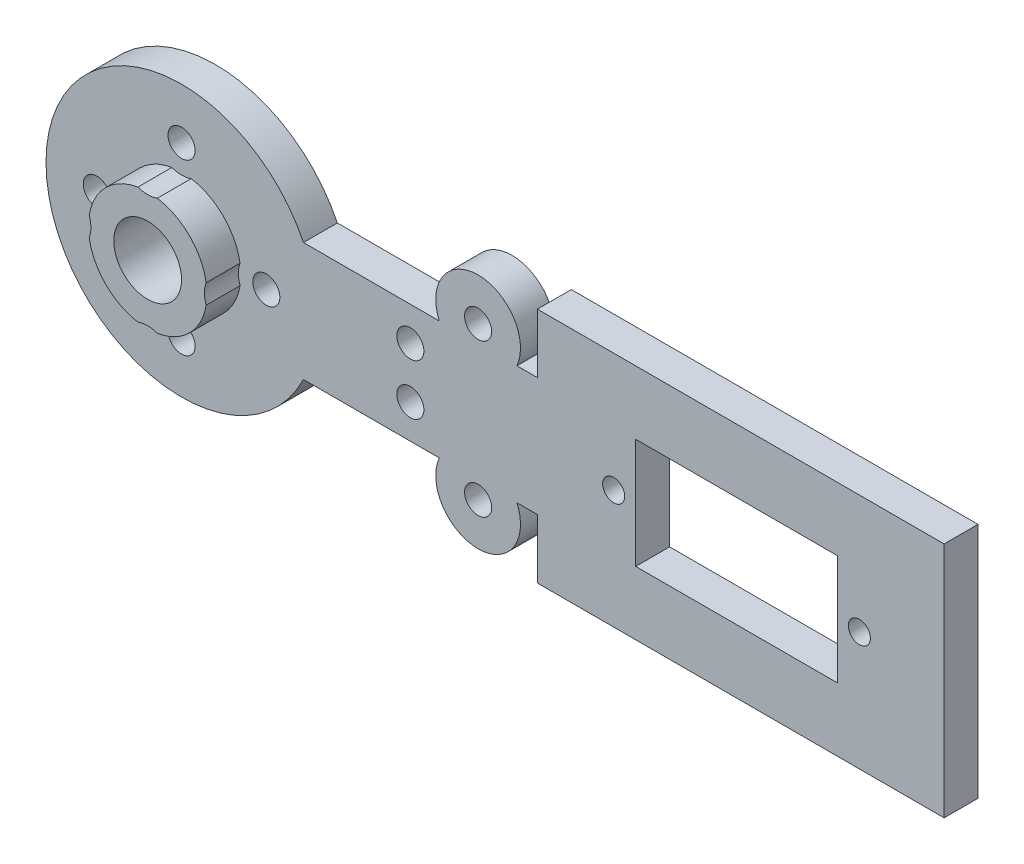
ISO-10303-21;
HEADER;
FILE_DESCRIPTION(('STEP AP214'),'2;1');
FILE_NAME('part.step','',(''),(''),'','','');
FILE_SCHEMA(('AUTOMOTIVE_DESIGN { 1 0 10303 214 1 1 1 1 }'));
ENDSEC;
DATA;
#1=APPLICATION_CONTEXT('core data for automotive mechanical design processes');
#2=APPLICATION_PROTOCOL_DEFINITION('international standard','automotive_design',2000,#1);
#3=PRODUCT_CONTEXT('',#1,'mechanical');
#4=PRODUCT('Part','Part','',(#3));
#5=PRODUCT_RELATED_PRODUCT_CATEGORY('part','',(#4));
#6=PRODUCT_DEFINITION_FORMATION('','',#4);
#7=PRODUCT_DEFINITION_CONTEXT('part definition',#1,'design');
#8=PRODUCT_DEFINITION('design','',#6,#7);
#9=PRODUCT_DEFINITION_SHAPE('','',#8);
#10=(LENGTH_UNIT() NAMED_UNIT(*) SI_UNIT(.MILLI.,.METRE.));
#11=(NAMED_UNIT(*) PLANE_ANGLE_UNIT() SI_UNIT($,.RADIAN.));
#12=(NAMED_UNIT(*) SI_UNIT($,.STERADIAN.) SOLID_ANGLE_UNIT());
#13=UNCERTAINTY_MEASURE_WITH_UNIT(LENGTH_MEASURE(1.E-05),#10,'distance_accuracy_value','');
#14=(GEOMETRIC_REPRESENTATION_CONTEXT(3) GLOBAL_UNCERTAINTY_ASSIGNED_CONTEXT((#13)) GLOBAL_UNIT_ASSIGNED_CONTEXT((#10,
#11,#12)) REPRESENTATION_CONTEXT('',''));
#15=CARTESIAN_POINT('',(0.,0.,0.));
#16=DIRECTION('',(0.,0.,1.));
#17=DIRECTION('',(1.,0.,0.));
#18=AXIS2_PLACEMENT_3D('',#15,#16,#17);
#19=CARTESIAN_POINT('',(0.,0.,8.));
#20=DIRECTION('',(0.,0.,1.));
#21=DIRECTION('',(1.,0.,0.));
#22=AXIS2_PLACEMENT_3D('',#19,#20,#21);
#23=PLANE('',#22);
#24=CARTESIAN_POINT('',(0.,0.,8.));
#25=DIRECTION('',(0.,0.,1.));
#26=DIRECTION('',(1.,0.,0.));
#27=AXIS2_PLACEMENT_3D('',#24,#25,#26);
#28=CIRCLE('',#27,4.);
#29=CARTESIAN_POINT('',(4.,0.,8.));
#30=VERTEX_POINT('',#29);
#31=EDGE_CURVE('E437',#30,#30,#28,.T.);
#32=ORIENTED_EDGE('',*,*,#31,.F.);
#33=EDGE_LOOP('',(#32));
#34=FACE_BOUND('',#33,.T.);
#35=CARTESIAN_POINT('',(10.,0.,8.));
#36=DIRECTION('',(0.,0.,1.));
#37=DIRECTION('',(1.,0.,0.));
#38=AXIS2_PLACEMENT_3D('',#35,#36,#37);
#39=CIRCLE('',#38,3.3);
#40=CARTESIAN_POINT('',(6.9055,1.14632881408433,8.));
#41=VERTEX_POINT('',#40);
#42=CARTESIAN_POINT('',(6.9055,-1.14632881408433,8.));
#43=VERTEX_POINT('',#42);
#44=EDGE_CURVE('E426',#41,#43,#39,.T.);
#45=ORIENTED_EDGE('',*,*,#44,.F.);
#46=CARTESIAN_POINT('',(0.,0.,8.));
#47=DIRECTION('',(0.,0.,1.));
#48=DIRECTION('',(1.,0.,0.));
#49=AXIS2_PLACEMENT_3D('',#46,#47,#48);
#50=CIRCLE('',#49,7.);
#51=CARTESIAN_POINT('',(1.14632881408434,6.9055,8.));
#52=VERTEX_POINT('',#51);
#53=EDGE_CURVE('E234',#41,#52,#50,.T.);
#54=ORIENTED_EDGE('',*,*,#53,.T.);
#55=CARTESIAN_POINT('',(0.,10.,8.));
#56=DIRECTION('',(0.,0.,1.));
#57=DIRECTION('',(1.,0.,0.));
#58=AXIS2_PLACEMENT_3D('',#55,#56,#57);
#59=CIRCLE('',#58,3.3);
#60=CARTESIAN_POINT('',(-1.14632881408434,6.9055,8.));
#61=VERTEX_POINT('',#60);
#62=EDGE_CURVE('E225',#61,#52,#59,.T.);
#63=ORIENTED_EDGE('',*,*,#62,.F.);
#64=CARTESIAN_POINT('',(-6.9055,1.14632881408434,8.));
#65=VERTEX_POINT('',#64);
#66=EDGE_CURVE('E442',#61,#65,#50,.T.);
#67=ORIENTED_EDGE('',*,*,#66,.T.);
#68=CARTESIAN_POINT('',(-10.,0.,8.));
#69=DIRECTION('',(0.,0.,1.));
#70=DIRECTION('',(1.,0.,0.));
#71=AXIS2_PLACEMENT_3D('',#68,#69,#70);
#72=CIRCLE('',#71,3.3);
#73=CARTESIAN_POINT('',(-6.9055,-1.14632881408434,8.));
#74=VERTEX_POINT('',#73);
#75=EDGE_CURVE('E454',#74,#65,#72,.T.);
#76=ORIENTED_EDGE('',*,*,#75,.F.);
#77=CARTESIAN_POINT('',(-1.14632881408434,-6.9055,8.));
#78=VERTEX_POINT('',#77);
#79=EDGE_CURVE('E444',#74,#78,#50,.T.);
#80=ORIENTED_EDGE('',*,*,#79,.T.);
#81=CARTESIAN_POINT('',(0.,-10.,8.));
#82=DIRECTION('',(0.,0.,1.));
#83=DIRECTION('',(1.,0.,0.));
#84=AXIS2_PLACEMENT_3D('',#81,#82,#83);
#85=CIRCLE('',#84,3.3);
#86=CARTESIAN_POINT('',(1.14632881408434,-6.9055,8.));
#87=VERTEX_POINT('',#86);
#88=EDGE_CURVE('E203',#87,#78,#85,.T.);
#89=ORIENTED_EDGE('',*,*,#88,.F.);
#90=EDGE_CURVE('E438',#87,#43,#50,.T.);
#91=ORIENTED_EDGE('',*,*,#90,.T.);
#92=EDGE_LOOP('',(#45,#54,#63,#67,#76,#80,#89,#91));
#93=FACE_BOUND('',#92,.T.);
#94=ADVANCED_FACE('F43',(#34,#93),#23,.T.);
#95=CARTESIAN_POINT('',(0.,0.,8.));
#96=DIRECTION('',(0.,0.,-1.));
#97=DIRECTION('',(-1.,0.,0.));
#98=AXIS2_PLACEMENT_3D('',#95,#96,#97);
#99=CYLINDRICAL_SURFACE('',#98,7.);
#100=DIRECTION('',(0.,0.,-1.));
#101=VECTOR('',#100,1.);
#102=CARTESIAN_POINT('',(6.9055,-1.14632881408434,6.));
#103=LINE('',#102,#101);
#104=CARTESIAN_POINT('',(6.9055,-1.14632881408433,4.));
#105=VERTEX_POINT('',#104);
#106=EDGE_CURVE('E11',#43,#105,#103,.T.);
#107=ORIENTED_EDGE('',*,*,#106,.F.);
#108=ORIENTED_EDGE('',*,*,#90,.F.);
#109=DIRECTION('',(0.,0.,-1.));
#110=VECTOR('',#109,1.);
#111=CARTESIAN_POINT('',(1.14632881408434,-6.9055,6.));
#112=LINE('',#111,#110);
#113=CARTESIAN_POINT('',(1.14632881408434,-6.9055,4.));
#114=VERTEX_POINT('',#113);
#115=EDGE_CURVE('E208',#114,#87,#112,.F.);
#116=ORIENTED_EDGE('',*,*,#115,.F.);
#117=CARTESIAN_POINT('',(0.,0.,4.));
#118=DIRECTION('',(0.,0.,1.));
#119=DIRECTION('',(1.,0.,0.));
#120=AXIS2_PLACEMENT_3D('',#117,#118,#119);
#121=CIRCLE('',#120,7.);
#122=EDGE_CURVE('E221',#114,#105,#121,.T.);
#123=ORIENTED_EDGE('',*,*,#122,.T.);
#124=EDGE_LOOP('',(#107,#108,#116,#123));
#125=FACE_BOUND('',#124,.T.);
#126=ADVANCED_FACE('F459',(#125),#99,.T.);
#127=DIRECTION('',(0.,0.,-1.));
#128=VECTOR('',#127,1.);
#129=CARTESIAN_POINT('',(6.9055,1.14632881408434,6.));
#130=LINE('',#129,#128);
#131=CARTESIAN_POINT('',(6.9055,1.14632881408433,4.));
#132=VERTEX_POINT('',#131);
#133=EDGE_CURVE('E51',#132,#41,#130,.F.);
#134=ORIENTED_EDGE('',*,*,#133,.F.);
#135=CARTESIAN_POINT('',(1.14632881408434,6.9055,4.));
#136=VERTEX_POINT('',#135);
#137=EDGE_CURVE('E230',#132,#136,#121,.T.);
#138=ORIENTED_EDGE('',*,*,#137,.T.);
#139=DIRECTION('',(0.,0.,-1.));
#140=VECTOR('',#139,1.);
#141=CARTESIAN_POINT('',(1.14632881408434,6.9055,6.));
#142=LINE('',#141,#140);
#143=EDGE_CURVE('E419',#52,#136,#142,.T.);
#144=ORIENTED_EDGE('',*,*,#143,.F.);
#145=ORIENTED_EDGE('',*,*,#53,.F.);
#146=EDGE_LOOP('',(#134,#138,#144,#145));
#147=FACE_BOUND('',#146,.T.);
#148=ADVANCED_FACE('F445',(#147),#99,.T.);
#149=DIRECTION('',(0.,0.,-1.));
#150=VECTOR('',#149,1.);
#151=CARTESIAN_POINT('',(-6.9055,1.14632881408434,6.));
#152=LINE('',#151,#150);
#153=CARTESIAN_POINT('',(-6.9055,1.14632881408434,4.));
#154=VERTEX_POINT('',#153);
#155=EDGE_CURVE('E421',#65,#154,#152,.T.);
#156=ORIENTED_EDGE('',*,*,#155,.F.);
#157=ORIENTED_EDGE('',*,*,#66,.F.);
#158=DIRECTION('',(0.,0.,-1.));
#159=VECTOR('',#158,1.);
#160=CARTESIAN_POINT('',(-1.14632881408434,6.9055,6.));
#161=LINE('',#160,#159);
#162=CARTESIAN_POINT('',(-1.14632881408434,6.9055,4.));
#163=VERTEX_POINT('',#162);
#164=EDGE_CURVE('E209',#163,#61,#161,.F.);
#165=ORIENTED_EDGE('',*,*,#164,.F.);
#166=EDGE_CURVE('E228',#163,#154,#121,.T.);
#167=ORIENTED_EDGE('',*,*,#166,.T.);
#168=EDGE_LOOP('',(#156,#157,#165,#167));
#169=FACE_BOUND('',#168,.T.);
#170=ADVANCED_FACE('F464',(#169),#99,.T.);
#171=DIRECTION('',(0.,0.,-1.));
#172=VECTOR('',#171,1.);
#173=CARTESIAN_POINT('',(-6.9055,-1.14632881408434,6.));
#174=LINE('',#173,#172);
#175=CARTESIAN_POINT('',(-6.9055,-1.14632881408434,4.));
#176=VERTEX_POINT('',#175);
#177=EDGE_CURVE('E224',#176,#74,#174,.F.);
#178=ORIENTED_EDGE('',*,*,#177,.F.);
#179=CARTESIAN_POINT('',(-1.14632881408434,-6.9055,4.));
#180=VERTEX_POINT('',#179);
#181=EDGE_CURVE('E216',#176,#180,#121,.T.);
#182=ORIENTED_EDGE('',*,*,#181,.T.);
#183=DIRECTION('',(0.,0.,-1.));
#184=VECTOR('',#183,1.);
#185=CARTESIAN_POINT('',(-1.14632881408434,-6.9055,6.));
#186=LINE('',#185,#184);
#187=EDGE_CURVE('E201',#78,#180,#186,.T.);
#188=ORIENTED_EDGE('',*,*,#187,.F.);
#189=ORIENTED_EDGE('',*,*,#79,.F.);
#190=EDGE_LOOP('',(#178,#182,#188,#189));
#191=FACE_BOUND('',#190,.T.);
#192=ADVANCED_FACE('F223',(#191),#99,.T.);
#193=CARTESIAN_POINT('',(0.,7.,4.));
#194=DIRECTION('',(0.,-1.,0.));
#195=DIRECTION('',(0.,0.,-1.));
#196=AXIS2_PLACEMENT_3D('',#193,#194,#195);
#197=PLANE('',#196);
#198=DIRECTION('',(0.,0.,-1.));
#199=VECTOR('',#198,1.);
#200=CARTESIAN_POINT('',(30.4174243050442,7.,4.));
#201=LINE('',#200,#199);
#202=CARTESIAN_POINT('',(30.4174243050442,7.,0.));
#203=VERTEX_POINT('',#202);
#204=CARTESIAN_POINT('',(30.4174243050442,7.,4.));
#205=VERTEX_POINT('',#204);
#206=EDGE_CURVE('E229',#203,#205,#201,.F.);
#207=ORIENTED_EDGE('',*,*,#206,.F.);
#208=DIRECTION('',(-1.,0.,0.));
#209=VECTOR('',#208,1.);
#210=CARTESIAN_POINT('',(0.,7.,0.));
#211=LINE('',#210,#209);
#212=CARTESIAN_POINT('',(14.3874945699382,7.,0.));
#213=VERTEX_POINT('',#212);
#214=EDGE_CURVE('E368',#203,#213,#211,.T.);
#215=ORIENTED_EDGE('',*,*,#214,.T.);
#216=DIRECTION('',(0.,0.,-1.));
#217=VECTOR('',#216,1.);
#218=CARTESIAN_POINT('',(14.3874945699382,7.,4.));
#219=LINE('',#218,#217);
#220=CARTESIAN_POINT('',(14.3874945699382,7.,4.));
#221=VERTEX_POINT('',#220);
#222=EDGE_CURVE('E346',#221,#213,#219,.T.);
#223=ORIENTED_EDGE('',*,*,#222,.F.);
#224=DIRECTION('',(-1.,0.,0.));
#225=VECTOR('',#224,1.);
#226=CARTESIAN_POINT('',(0.,7.,4.));
#227=LINE('',#226,#225);
#228=EDGE_CURVE('E359',#205,#221,#227,.T.);
#229=ORIENTED_EDGE('',*,*,#228,.F.);
#230=EDGE_LOOP('',(#207,#215,#223,#229));
#231=FACE_BOUND('',#230,.T.);
#232=ADVANCED_FACE('F581',(#231),#197,.F.);
#233=DIRECTION('',(0.,0.,-1.));
#234=VECTOR('',#233,1.);
#235=CARTESIAN_POINT('',(39.5825756949558,7.,4.));
#236=LINE('',#235,#234);
#237=CARTESIAN_POINT('',(39.5825756949558,7.,4.));
#238=VERTEX_POINT('',#237);
#239=CARTESIAN_POINT('',(39.5825756949558,7.,0.));
#240=VERTEX_POINT('',#239);
#241=EDGE_CURVE('E408',#238,#240,#236,.T.);
#242=ORIENTED_EDGE('',*,*,#241,.F.);
#243=CARTESIAN_POINT('',(42.,7.,4.));
#244=VERTEX_POINT('',#243);
#245=EDGE_CURVE('E365',#244,#238,#227,.T.);
#246=ORIENTED_EDGE('',*,*,#245,.F.);
#247=DIRECTION('',(0.,0.,1.));
#248=VECTOR('',#247,1.);
#249=CARTESIAN_POINT('',(42.,7.,4.));
#250=LINE('',#249,#248);
#251=CARTESIAN_POINT('',(42.,7.,0.));
#252=VERTEX_POINT('',#251);
#253=EDGE_CURVE('E336',#252,#244,#250,.T.);
#254=ORIENTED_EDGE('',*,*,#253,.F.);
#255=EDGE_CURVE('E367',#252,#240,#211,.T.);
#256=ORIENTED_EDGE('',*,*,#255,.T.);
#257=EDGE_LOOP('',(#242,#246,#254,#256));
#258=FACE_BOUND('',#257,.T.);
#259=ADVANCED_FACE('F582',(#258),#197,.F.);
#260=CARTESIAN_POINT('',(0.,-7.,4.));
#261=DIRECTION('',(0.,1.,0.));
#262=DIRECTION('',(0.,0.,1.));
#263=AXIS2_PLACEMENT_3D('',#260,#261,#262);
#264=PLANE('',#263);
#265=DIRECTION('',(0.,0.,-1.));
#266=VECTOR('',#265,1.);
#267=CARTESIAN_POINT('',(39.5825756949558,-7.,4.));
#268=LINE('',#267,#266);
#269=CARTESIAN_POINT('',(39.5825756949558,-7.,0.));
#270=VERTEX_POINT('',#269);
#271=CARTESIAN_POINT('',(39.5825756949558,-7.,4.));
#272=VERTEX_POINT('',#271);
#273=EDGE_CURVE('E406',#270,#272,#268,.F.);
#274=ORIENTED_EDGE('',*,*,#273,.F.);
#275=DIRECTION('',(1.,0.,0.));
#276=VECTOR('',#275,1.);
#277=CARTESIAN_POINT('',(0.,-7.,0.));
#278=LINE('',#277,#276);
#279=CARTESIAN_POINT('',(42.,-7.,0.));
#280=VERTEX_POINT('',#279);
#281=EDGE_CURVE('E358',#270,#280,#278,.T.);
#282=ORIENTED_EDGE('',*,*,#281,.T.);
#283=DIRECTION('',(0.,0.,-1.));
#284=VECTOR('',#283,1.);
#285=CARTESIAN_POINT('',(42.,-7.,4.));
#286=LINE('',#285,#284);
#287=CARTESIAN_POINT('',(42.,-7.,4.));
#288=VERTEX_POINT('',#287);
#289=EDGE_CURVE('E341',#288,#280,#286,.T.);
#290=ORIENTED_EDGE('',*,*,#289,.F.);
#291=DIRECTION('',(1.,0.,0.));
#292=VECTOR('',#291,1.);
#293=CARTESIAN_POINT('',(0.,-7.,4.));
#294=LINE('',#293,#292);
#295=EDGE_CURVE('E363',#272,#288,#294,.T.);
#296=ORIENTED_EDGE('',*,*,#295,.F.);
#297=EDGE_LOOP('',(#274,#282,#290,#296));
#298=FACE_BOUND('',#297,.T.);
#299=ADVANCED_FACE('F44',(#298),#264,.F.);
#300=DIRECTION('',(0.,0.,-1.));
#301=VECTOR('',#300,1.);
#302=CARTESIAN_POINT('',(30.4174243050442,-7.,4.));
#303=LINE('',#302,#301);
#304=CARTESIAN_POINT('',(30.4174243050442,-7.,4.));
#305=VERTEX_POINT('',#304);
#306=CARTESIAN_POINT('',(30.4174243050442,-7.,0.));
#307=VERTEX_POINT('',#306);
#308=EDGE_CURVE('E385',#305,#307,#303,.T.);
#309=ORIENTED_EDGE('',*,*,#308,.F.);
#310=CARTESIAN_POINT('',(14.3874945699382,-7.,4.));
#311=VERTEX_POINT('',#310);
#312=EDGE_CURVE('E357',#311,#305,#294,.T.);
#313=ORIENTED_EDGE('',*,*,#312,.F.);
#314=DIRECTION('',(0.,0.,-1.));
#315=VECTOR('',#314,1.);
#316=CARTESIAN_POINT('',(14.3874945699382,-7.,4.));
#317=LINE('',#316,#315);
#318=CARTESIAN_POINT('',(14.3874945699382,-7.,0.));
#319=VERTEX_POINT('',#318);
#320=EDGE_CURVE('E352',#319,#311,#317,.F.);
#321=ORIENTED_EDGE('',*,*,#320,.F.);
#322=EDGE_CURVE('E366',#319,#307,#278,.T.);
#323=ORIENTED_EDGE('',*,*,#322,.T.);
#324=EDGE_LOOP('',(#309,#313,#321,#323));
#325=FACE_BOUND('',#324,.T.);
#326=ADVANCED_FACE('F579',(#325),#264,.F.);
#327=CARTESIAN_POINT('',(0.,0.,4.));
#328=DIRECTION('',(0.,0.,-1.));
#329=DIRECTION('',(-1.,0.,0.));
#330=AXIS2_PLACEMENT_3D('',#327,#328,#329);
#331=PLANE('',#330);
#332=ORIENTED_EDGE('',*,*,#137,.F.);
#333=CARTESIAN_POINT('',(10.,0.,4.));
#334=DIRECTION('',(0.,0.,1.));
#335=DIRECTION('',(1.,0.,0.));
#336=AXIS2_PLACEMENT_3D('',#333,#334,#335);
#337=CIRCLE('',#336,3.3);
#338=EDGE_CURVE('E427',#132,#105,#337,.T.);
#339=ORIENTED_EDGE('',*,*,#338,.T.);
#340=ORIENTED_EDGE('',*,*,#122,.F.);
#341=CARTESIAN_POINT('',(0.,-10.,4.));
#342=DIRECTION('',(0.,0.,1.));
#343=DIRECTION('',(1.,0.,0.));
#344=AXIS2_PLACEMENT_3D('',#341,#342,#343);
#345=CIRCLE('',#344,3.3);
#346=EDGE_CURVE('E59',#114,#180,#345,.T.);
#347=ORIENTED_EDGE('',*,*,#346,.T.);
#348=ORIENTED_EDGE('',*,*,#181,.F.);
#349=CARTESIAN_POINT('',(-10.,0.,4.));
#350=DIRECTION('',(0.,0.,1.));
#351=DIRECTION('',(1.,0.,0.));
#352=AXIS2_PLACEMENT_3D('',#349,#350,#351);
#353=CIRCLE('',#352,3.3);
#354=EDGE_CURVE('E68',#176,#154,#353,.T.);
#355=ORIENTED_EDGE('',*,*,#354,.T.);
#356=ORIENTED_EDGE('',*,*,#166,.F.);
#357=CARTESIAN_POINT('',(0.,10.,4.));
#358=DIRECTION('',(0.,0.,1.));
#359=DIRECTION('',(1.,0.,0.));
#360=AXIS2_PLACEMENT_3D('',#357,#358,#359);
#361=CIRCLE('',#360,3.3);
#362=EDGE_CURVE('E455',#163,#136,#361,.T.);
#363=ORIENTED_EDGE('',*,*,#362,.T.);
#364=EDGE_LOOP('',(#332,#339,#340,#347,#348,#355,#356,#363));
#365=FACE_BOUND('',#364,.T.);
#366=CARTESIAN_POINT('',(35.,-9.,4.));
#367=DIRECTION('',(0.,0.,1.));
#368=DIRECTION('',(1.,0.,0.));
#369=AXIS2_PLACEMENT_3D('',#366,#367,#368);
#370=CIRCLE('',#369,1.6);
#371=CARTESIAN_POINT('',(36.6,-9.,4.));
#372=VERTEX_POINT('',#371);
#373=EDGE_CURVE('E236',#372,#372,#370,.T.);
#374=ORIENTED_EDGE('',*,*,#373,.F.);
#375=EDGE_LOOP('',(#374));
#376=FACE_BOUND('',#375,.T.);
#377=CARTESIAN_POINT('',(35.,9.,4.));
#378=DIRECTION('',(0.,0.,1.));
#379=DIRECTION('',(1.,0.,0.));
#380=AXIS2_PLACEMENT_3D('',#377,#378,#379);
#381=CIRCLE('',#380,1.6);
#382=CARTESIAN_POINT('',(36.6,9.,4.));
#383=VERTEX_POINT('',#382);
#384=EDGE_CURVE('E239',#383,#383,#381,.T.);
#385=ORIENTED_EDGE('',*,*,#384,.F.);
#386=EDGE_LOOP('',(#385));
#387=FACE_BOUND('',#386,.T.);
#388=ORIENTED_EDGE('',*,*,#245,.T.);
#389=CARTESIAN_POINT('',(35.,9.,4.));
#390=DIRECTION('',(0.,0.,1.));
#391=DIRECTION('',(1.,0.,0.));
#392=AXIS2_PLACEMENT_3D('',#389,#390,#391);
#393=CIRCLE('',#392,5.);
#394=EDGE_CURVE('E243',#238,#205,#393,.T.);
#395=ORIENTED_EDGE('',*,*,#394,.T.);
#396=ORIENTED_EDGE('',*,*,#228,.T.);
#397=CARTESIAN_POINT('',(0.,0.,4.));
#398=DIRECTION('',(0.,0.,1.));
#399=DIRECTION('',(1.,0.,0.));
#400=AXIS2_PLACEMENT_3D('',#397,#398,#399);
#401=CIRCLE('',#400,16.);
#402=EDGE_CURVE('E344',#221,#311,#401,.T.);
#403=ORIENTED_EDGE('',*,*,#402,.T.);
#404=ORIENTED_EDGE('',*,*,#312,.T.);
#405=CARTESIAN_POINT('',(35.,-9.,4.));
#406=DIRECTION('',(0.,0.,1.));
#407=DIRECTION('',(1.,0.,0.));
#408=AXIS2_PLACEMENT_3D('',#405,#406,#407);
#409=CIRCLE('',#408,5.);
#410=EDGE_CURVE('E252',#305,#272,#409,.T.);
#411=ORIENTED_EDGE('',*,*,#410,.T.);
#412=ORIENTED_EDGE('',*,*,#295,.T.);
#413=DIRECTION('',(0.,-1.,0.));
#414=VECTOR('',#413,1.);
#415=CARTESIAN_POINT('',(42.,-14.,4.));
#416=LINE('',#415,#414);
#417=CARTESIAN_POINT('',(42.,-14.,4.));
#418=VERTEX_POINT('',#417);
#419=EDGE_CURVE('E311',#288,#418,#416,.T.);
#420=ORIENTED_EDGE('',*,*,#419,.T.);
#421=DIRECTION('',(1.,0.,0.));
#422=VECTOR('',#421,1.);
#423=CARTESIAN_POINT('',(42.,-14.,4.));
#424=LINE('',#423,#422);
#425=CARTESIAN_POINT('',(90.,-14.,4.));
#426=VERTEX_POINT('',#425);
#427=EDGE_CURVE('E309',#418,#426,#424,.T.);
#428=ORIENTED_EDGE('',*,*,#427,.T.);
#429=DIRECTION('',(0.,1.,0.));
#430=VECTOR('',#429,1.);
#431=CARTESIAN_POINT('',(90.,-14.,4.));
#432=LINE('',#431,#430);
#433=CARTESIAN_POINT('',(90.,14.,4.));
#434=VERTEX_POINT('',#433);
#435=EDGE_CURVE('E312',#426,#434,#432,.T.);
#436=ORIENTED_EDGE('',*,*,#435,.T.);
#437=DIRECTION('',(-1.,0.,0.));
#438=VECTOR('',#437,1.);
#439=CARTESIAN_POINT('',(42.,14.,4.));
#440=LINE('',#439,#438);
#441=CARTESIAN_POINT('',(42.,14.,4.));
#442=VERTEX_POINT('',#441);
#443=EDGE_CURVE('E314',#434,#442,#440,.T.);
#444=ORIENTED_EDGE('',*,*,#443,.T.);
#445=EDGE_CURVE('E310',#442,#244,#416,.T.);
#446=ORIENTED_EDGE('',*,*,#445,.T.);
#447=EDGE_LOOP('',(#388,#395,#396,#403,#404,#411,#412,#420,#428,#436,#444,#446));
#448=FACE_BOUND('',#447,.T.);
#449=CARTESIAN_POINT('',(27.,-3.,4.));
#450=DIRECTION('',(0.,0.,1.));
#451=DIRECTION('',(1.,0.,0.));
#452=AXIS2_PLACEMENT_3D('',#449,#450,#451);
#453=CIRCLE('',#452,1.6);
#454=CARTESIAN_POINT('',(28.6,-3.,4.));
#455=VERTEX_POINT('',#454);
#456=EDGE_CURVE('E260',#455,#455,#453,.T.);
#457=ORIENTED_EDGE('',*,*,#456,.F.);
#458=EDGE_LOOP('',(#457));
#459=FACE_BOUND('',#458,.T.);
#460=CARTESIAN_POINT('',(27.,3.,4.));
#461=DIRECTION('',(0.,0.,1.));
#462=DIRECTION('',(1.,0.,0.));
#463=AXIS2_PLACEMENT_3D('',#460,#461,#462);
#464=CIRCLE('',#463,1.6);
#465=CARTESIAN_POINT('',(28.6,3.,4.));
#466=VERTEX_POINT('',#465);
#467=EDGE_CURVE('E251',#466,#466,#464,.T.);
#468=ORIENTED_EDGE('',*,*,#467,.F.);
#469=EDGE_LOOP('',(#468));
#470=FACE_BOUND('',#469,.T.);
#471=CARTESIAN_POINT('',(51.,0.,4.));
#472=DIRECTION('',(0.,0.,1.));
#473=DIRECTION('',(1.,0.,0.));
#474=AXIS2_PLACEMENT_3D('',#471,#472,#473);
#475=CIRCLE('',#474,1.3);
#476=CARTESIAN_POINT('',(52.3,0.,4.));
#477=VERTEX_POINT('',#476);
#478=EDGE_CURVE('E280',#477,#477,#475,.T.);
#479=ORIENTED_EDGE('',*,*,#478,.F.);
#480=EDGE_LOOP('',(#479));
#481=FACE_BOUND('',#480,.T.);
#482=CARTESIAN_POINT('',(80.,0.,4.));
#483=DIRECTION('',(0.,0.,1.));
#484=DIRECTION('',(1.,0.,0.));
#485=AXIS2_PLACEMENT_3D('',#482,#483,#484);
#486=CIRCLE('',#485,1.3);
#487=CARTESIAN_POINT('',(81.3,0.,4.));
#488=VERTEX_POINT('',#487);
#489=EDGE_CURVE('E283',#488,#488,#486,.T.);
#490=ORIENTED_EDGE('',*,*,#489,.F.);
#491=EDGE_LOOP('',(#490));
#492=FACE_BOUND('',#491,.T.);
#493=DIRECTION('',(0.,-1.,0.));
#494=VECTOR('',#493,1.);
#495=CARTESIAN_POINT('',(53.6,-6.5,4.));
#496=LINE('',#495,#494);
#497=CARTESIAN_POINT('',(53.6,6.5,4.));
#498=VERTEX_POINT('',#497);
#499=CARTESIAN_POINT('',(53.6,-6.5,4.));
#500=VERTEX_POINT('',#499);
#501=EDGE_CURVE('E282',#498,#500,#496,.T.);
#502=ORIENTED_EDGE('',*,*,#501,.F.);
#503=DIRECTION('',(-1.,0.,0.));
#504=VECTOR('',#503,1.);
#505=CARTESIAN_POINT('',(53.6,6.5,4.));
#506=LINE('',#505,#504);
#507=CARTESIAN_POINT('',(77.4,6.5,4.));
#508=VERTEX_POINT('',#507);
#509=EDGE_CURVE('E291',#508,#498,#506,.T.);
#510=ORIENTED_EDGE('',*,*,#509,.F.);
#511=DIRECTION('',(0.,1.,0.));
#512=VECTOR('',#511,1.);
#513=CARTESIAN_POINT('',(77.4,-6.5,4.));
#514=LINE('',#513,#512);
#515=CARTESIAN_POINT('',(77.4,-6.5,4.));
#516=VERTEX_POINT('',#515);
#517=EDGE_CURVE('E289',#516,#508,#514,.T.);
#518=ORIENTED_EDGE('',*,*,#517,.F.);
#519=DIRECTION('',(1.,0.,0.));
#520=VECTOR('',#519,1.);
#521=CARTESIAN_POINT('',(53.6,-6.5,4.));
#522=LINE('',#521,#520);
#523=EDGE_CURVE('E290',#500,#516,#522,.T.);
#524=ORIENTED_EDGE('',*,*,#523,.F.);
#525=EDGE_LOOP('',(#502,#510,#518,#524));
#526=FACE_BOUND('',#525,.T.);
#527=CARTESIAN_POINT('',(0.,-10.,4.));
#528=DIRECTION('',(0.,0.,1.));
#529=DIRECTION('',(1.,0.,0.));
#530=AXIS2_PLACEMENT_3D('',#527,#528,#529);
#531=CIRCLE('',#530,1.6);
#532=CARTESIAN_POINT('',(1.6,-10.,4.));
#533=VERTEX_POINT('',#532);
#534=EDGE_CURVE('E270',#533,#533,#531,.T.);
#535=ORIENTED_EDGE('',*,*,#534,.F.);
#536=EDGE_LOOP('',(#535));
#537=FACE_BOUND('',#536,.T.);
#538=CARTESIAN_POINT('',(0.,10.,4.));
#539=DIRECTION('',(0.,0.,1.));
#540=DIRECTION('',(1.,0.,0.));
#541=AXIS2_PLACEMENT_3D('',#538,#539,#540);
#542=CIRCLE('',#541,1.6);
#543=CARTESIAN_POINT('',(1.6,10.,4.));
#544=VERTEX_POINT('',#543);
#545=EDGE_CURVE('E261',#544,#544,#542,.T.);
#546=ORIENTED_EDGE('',*,*,#545,.F.);
#547=EDGE_LOOP('',(#546));
#548=FACE_BOUND('',#547,.T.);
#549=CARTESIAN_POINT('',(-10.,0.,4.));
#550=DIRECTION('',(0.,0.,1.));
#551=DIRECTION('',(1.,0.,0.));
#552=AXIS2_PLACEMENT_3D('',#549,#550,#551);
#553=CIRCLE('',#552,1.6);
#554=CARTESIAN_POINT('',(-8.4,0.,4.));
#555=VERTEX_POINT('',#554);
#556=EDGE_CURVE('E271',#555,#555,#553,.T.);
#557=ORIENTED_EDGE('',*,*,#556,.F.);
#558=EDGE_LOOP('',(#557));
#559=FACE_BOUND('',#558,.T.);
#560=CARTESIAN_POINT('',(10.,0.,4.));
#561=DIRECTION('',(0.,0.,1.));
#562=DIRECTION('',(1.,0.,0.));
#563=AXIS2_PLACEMENT_3D('',#560,#561,#562);
#564=CIRCLE('',#563,1.6);
#565=CARTESIAN_POINT('',(11.6,0.,4.));
#566=VERTEX_POINT('',#565);
#567=EDGE_CURVE('E269',#566,#566,#564,.T.);
#568=ORIENTED_EDGE('',*,*,#567,.F.);
#569=EDGE_LOOP('',(#568));
#570=FACE_BOUND('',#569,.T.);
#571=ADVANCED_FACE('F218',(#365,#376,#387,#448,#459,#470,#481,#492,#526,#537,#548,#559,#570),
#331,.F.);
#572=CARTESIAN_POINT('',(0.,0.,0.));
#573=DIRECTION('',(0.,0.,-1.));
#574=DIRECTION('',(-1.,0.,0.));
#575=AXIS2_PLACEMENT_3D('',#572,#573,#574);
#576=PLANE('',#575);
#577=CARTESIAN_POINT('',(35.,-9.,0.));
#578=DIRECTION('',(0.,0.,-1.));
#579=DIRECTION('',(-1.,0.,0.));
#580=AXIS2_PLACEMENT_3D('',#577,#578,#579);
#581=CIRCLE('',#580,1.6);
#582=CARTESIAN_POINT('',(33.4,-9.,0.));
#583=VERTEX_POINT('',#582);
#584=EDGE_CURVE('E249',#583,#583,#581,.F.);
#585=ORIENTED_EDGE('',*,*,#584,.T.);
#586=EDGE_LOOP('',(#585));
#587=FACE_BOUND('',#586,.T.);
#588=CARTESIAN_POINT('',(35.,9.,0.));
#589=DIRECTION('',(0.,0.,-1.));
#590=DIRECTION('',(-1.,0.,0.));
#591=AXIS2_PLACEMENT_3D('',#588,#589,#590);
#592=CIRCLE('',#591,1.6);
#593=CARTESIAN_POINT('',(33.4,9.,0.));
#594=VERTEX_POINT('',#593);
#595=EDGE_CURVE('E237',#594,#594,#592,.F.);
#596=ORIENTED_EDGE('',*,*,#595,.T.);
#597=EDGE_LOOP('',(#596));
#598=FACE_BOUND('',#597,.T.);
#599=CARTESIAN_POINT('',(27.,-3.,0.));
#600=DIRECTION('',(0.,0.,-1.));
#601=DIRECTION('',(-1.,0.,0.));
#602=AXIS2_PLACEMENT_3D('',#599,#600,#601);
#603=CIRCLE('',#602,1.6);
#604=CARTESIAN_POINT('',(25.4,-3.,0.));
#605=VERTEX_POINT('',#604);
#606=EDGE_CURVE('E276',#605,#605,#603,.F.);
#607=ORIENTED_EDGE('',*,*,#606,.T.);
#608=EDGE_LOOP('',(#607));
#609=FACE_BOUND('',#608,.T.);
#610=CARTESIAN_POINT('',(27.,3.,0.));
#611=DIRECTION('',(0.,0.,-1.));
#612=DIRECTION('',(-1.,0.,0.));
#613=AXIS2_PLACEMENT_3D('',#610,#611,#612);
#614=CIRCLE('',#613,1.6);
#615=CARTESIAN_POINT('',(25.4,3.,0.));
#616=VERTEX_POINT('',#615);
#617=EDGE_CURVE('E259',#616,#616,#614,.F.);
#618=ORIENTED_EDGE('',*,*,#617,.T.);
#619=EDGE_LOOP('',(#618));
#620=FACE_BOUND('',#619,.T.);
#621=CARTESIAN_POINT('',(0.,10.,0.));
#622=DIRECTION('',(0.,0.,-1.));
#623=DIRECTION('',(-1.,0.,0.));
#624=AXIS2_PLACEMENT_3D('',#621,#622,#623);
#625=CIRCLE('',#624,1.6);
#626=CARTESIAN_POINT('',(-1.6,10.,0.));
#627=VERTEX_POINT('',#626);
#628=EDGE_CURVE('E388',#627,#627,#625,.F.);
#629=ORIENTED_EDGE('',*,*,#628,.T.);
#630=EDGE_LOOP('',(#629));
#631=FACE_BOUND('',#630,.T.);
#632=CARTESIAN_POINT('',(0.,-10.,0.));
#633=DIRECTION('',(0.,0.,-1.));
#634=DIRECTION('',(-1.,0.,0.));
#635=AXIS2_PLACEMENT_3D('',#632,#633,#634);
#636=CIRCLE('',#635,1.6);
#637=CARTESIAN_POINT('',(-1.6,-10.,0.));
#638=VERTEX_POINT('',#637);
#639=EDGE_CURVE('E392',#638,#638,#636,.F.);
#640=ORIENTED_EDGE('',*,*,#639,.T.);
#641=EDGE_LOOP('',(#640));
#642=FACE_BOUND('',#641,.T.);
#643=CARTESIAN_POINT('',(10.,0.,0.));
#644=DIRECTION('',(0.,0.,-1.));
#645=DIRECTION('',(-1.,0.,0.));
#646=AXIS2_PLACEMENT_3D('',#643,#644,#645);
#647=CIRCLE('',#646,1.6);
#648=CARTESIAN_POINT('',(8.4,0.,0.));
#649=VERTEX_POINT('',#648);
#650=EDGE_CURVE('E395',#649,#649,#647,.F.);
#651=ORIENTED_EDGE('',*,*,#650,.T.);
#652=EDGE_LOOP('',(#651));
#653=FACE_BOUND('',#652,.T.);
#654=CARTESIAN_POINT('',(-10.,0.,0.));
#655=DIRECTION('',(0.,0.,-1.));
#656=DIRECTION('',(-1.,0.,0.));
#657=AXIS2_PLACEMENT_3D('',#654,#655,#656);
#658=CIRCLE('',#657,1.6);
#659=CARTESIAN_POINT('',(-11.6,0.,0.));
#660=VERTEX_POINT('',#659);
#661=EDGE_CURVE('E266',#660,#660,#658,.F.);
#662=ORIENTED_EDGE('',*,*,#661,.T.);
#663=EDGE_LOOP('',(#662));
#664=FACE_BOUND('',#663,.T.);
#665=CARTESIAN_POINT('',(0.,0.,0.));
#666=DIRECTION('',(0.,0.,-1.));
#667=DIRECTION('',(-1.,0.,0.));
#668=AXIS2_PLACEMENT_3D('',#665,#666,#667);
#669=CIRCLE('',#668,4.);
#670=CARTESIAN_POINT('',(-4.,0.,0.));
#671=VERTEX_POINT('',#670);
#672=EDGE_CURVE('E284',#671,#671,#669,.F.);
#673=ORIENTED_EDGE('',*,*,#672,.T.);
#674=EDGE_LOOP('',(#673));
#675=FACE_BOUND('',#674,.T.);
#676=CARTESIAN_POINT('',(51.,0.,0.));
#677=DIRECTION('',(0.,0.,-1.));
#678=DIRECTION('',(-1.,0.,0.));
#679=AXIS2_PLACEMENT_3D('',#676,#677,#678);
#680=CIRCLE('',#679,1.3);
#681=CARTESIAN_POINT('',(49.7,0.,0.));
#682=VERTEX_POINT('',#681);
#683=EDGE_CURVE('E287',#682,#682,#680,.F.);
#684=ORIENTED_EDGE('',*,*,#683,.T.);
#685=EDGE_LOOP('',(#684));
#686=FACE_BOUND('',#685,.T.);
#687=CARTESIAN_POINT('',(80.,0.,0.));
#688=DIRECTION('',(0.,0.,-1.));
#689=DIRECTION('',(-1.,0.,0.));
#690=AXIS2_PLACEMENT_3D('',#687,#688,#689);
#691=CIRCLE('',#690,1.3);
#692=CARTESIAN_POINT('',(78.7,0.,0.));
#693=VERTEX_POINT('',#692);
#694=EDGE_CURVE('E279',#693,#693,#691,.F.);
#695=ORIENTED_EDGE('',*,*,#694,.T.);
#696=EDGE_LOOP('',(#695));
#697=FACE_BOUND('',#696,.T.);
#698=ORIENTED_EDGE('',*,*,#214,.F.);
#699=CARTESIAN_POINT('',(35.,9.,0.));
#700=DIRECTION('',(0.,0.,1.));
#701=DIRECTION('',(1.,0.,0.));
#702=AXIS2_PLACEMENT_3D('',#699,#700,#701);
#703=CIRCLE('',#702,5.);
#704=EDGE_CURVE('E250',#240,#203,#703,.T.);
#705=ORIENTED_EDGE('',*,*,#704,.F.);
#706=ORIENTED_EDGE('',*,*,#255,.F.);
#707=DIRECTION('',(0.,-1.,0.));
#708=VECTOR('',#707,1.);
#709=CARTESIAN_POINT('',(42.,-14.,0.));
#710=LINE('',#709,#708);
#711=CARTESIAN_POINT('',(42.,14.,0.));
#712=VERTEX_POINT('',#711);
#713=EDGE_CURVE('E319',#712,#252,#710,.T.);
#714=ORIENTED_EDGE('',*,*,#713,.F.);
#715=DIRECTION('',(-1.,0.,0.));
#716=VECTOR('',#715,1.);
#717=CARTESIAN_POINT('',(42.,14.,0.));
#718=LINE('',#717,#716);
#719=CARTESIAN_POINT('',(90.,14.,0.));
#720=VERTEX_POINT('',#719);
#721=EDGE_CURVE('E324',#720,#712,#718,.T.);
#722=ORIENTED_EDGE('',*,*,#721,.F.);
#723=DIRECTION('',(0.,1.,0.));
#724=VECTOR('',#723,1.);
#725=CARTESIAN_POINT('',(90.,-14.,0.));
#726=LINE('',#725,#724);
#727=CARTESIAN_POINT('',(90.,-14.,0.));
#728=VERTEX_POINT('',#727);
#729=EDGE_CURVE('E322',#728,#720,#726,.T.);
#730=ORIENTED_EDGE('',*,*,#729,.F.);
#731=DIRECTION('',(1.,0.,0.));
#732=VECTOR('',#731,1.);
#733=CARTESIAN_POINT('',(42.,-14.,0.));
#734=LINE('',#733,#732);
#735=CARTESIAN_POINT('',(42.,-14.,0.));
#736=VERTEX_POINT('',#735);
#737=EDGE_CURVE('E321',#736,#728,#734,.T.);
#738=ORIENTED_EDGE('',*,*,#737,.F.);
#739=EDGE_CURVE('E306',#280,#736,#710,.T.);
#740=ORIENTED_EDGE('',*,*,#739,.F.);
#741=ORIENTED_EDGE('',*,*,#281,.F.);
#742=CARTESIAN_POINT('',(35.,-9.,0.));
#743=DIRECTION('',(0.,0.,1.));
#744=DIRECTION('',(1.,0.,0.));
#745=AXIS2_PLACEMENT_3D('',#742,#743,#744);
#746=CIRCLE('',#745,5.);
#747=EDGE_CURVE('E246',#307,#270,#746,.T.);
#748=ORIENTED_EDGE('',*,*,#747,.F.);
#749=ORIENTED_EDGE('',*,*,#322,.F.);
#750=CARTESIAN_POINT('',(0.,0.,0.));
#751=DIRECTION('',(0.,0.,1.));
#752=DIRECTION('',(1.,0.,0.));
#753=AXIS2_PLACEMENT_3D('',#750,#751,#752);
#754=CIRCLE('',#753,16.);
#755=EDGE_CURVE('E343',#213,#319,#754,.T.);
#756=ORIENTED_EDGE('',*,*,#755,.F.);
#757=EDGE_LOOP('',(#698,#705,#706,#714,#722,#730,#738,#740,#741,#748,#749,#756));
#758=FACE_BOUND('',#757,.T.);
#759=DIRECTION('',(-1.,0.,0.));
#760=VECTOR('',#759,1.);
#761=CARTESIAN_POINT('',(0.,6.5,0.));
#762=LINE('',#761,#760);
#763=CARTESIAN_POINT('',(77.4,6.5,0.));
#764=VERTEX_POINT('',#763);
#765=CARTESIAN_POINT('',(53.6,6.5,0.));
#766=VERTEX_POINT('',#765);
#767=EDGE_CURVE('E362',#764,#766,#762,.T.);
#768=ORIENTED_EDGE('',*,*,#767,.T.);
#769=DIRECTION('',(0.,-1.,0.));
#770=VECTOR('',#769,1.);
#771=CARTESIAN_POINT('',(53.6,0.,0.));
#772=LINE('',#771,#770);
#773=CARTESIAN_POINT('',(53.6,-6.5,0.));
#774=VERTEX_POINT('',#773);
#775=EDGE_CURVE('E378',#766,#774,#772,.T.);
#776=ORIENTED_EDGE('',*,*,#775,.T.);
#777=DIRECTION('',(1.,0.,0.));
#778=VECTOR('',#777,1.);
#779=CARTESIAN_POINT('',(0.,-6.5,0.));
#780=LINE('',#779,#778);
#781=CARTESIAN_POINT('',(77.4,-6.5,0.));
#782=VERTEX_POINT('',#781);
#783=EDGE_CURVE('E376',#774,#782,#780,.T.);
#784=ORIENTED_EDGE('',*,*,#783,.T.);
#785=DIRECTION('',(0.,1.,0.));
#786=VECTOR('',#785,1.);
#787=CARTESIAN_POINT('',(77.4,0.,0.));
#788=LINE('',#787,#786);
#789=EDGE_CURVE('E373',#782,#764,#788,.T.);
#790=ORIENTED_EDGE('',*,*,#789,.T.);
#791=EDGE_LOOP('',(#768,#776,#784,#790));
#792=FACE_BOUND('',#791,.T.);
#793=ADVANCED_FACE('F573',(#587,#598,#609,#620,#631,#642,#653,#664,#675,#686,#697,#758,#792),
#576,.T.);
#794=CARTESIAN_POINT('',(0.,0.,4.));
#795=DIRECTION('',(0.,0.,-1.));
#796=DIRECTION('',(-1.,0.,0.));
#797=AXIS2_PLACEMENT_3D('',#794,#795,#796);
#798=CYLINDRICAL_SURFACE('',#797,16.);
#799=ORIENTED_EDGE('',*,*,#755,.T.);
#800=ORIENTED_EDGE('',*,*,#320,.T.);
#801=ORIENTED_EDGE('',*,*,#402,.F.);
#802=ORIENTED_EDGE('',*,*,#222,.T.);
#803=EDGE_LOOP('',(#799,#800,#801,#802));
#804=FACE_BOUND('',#803,.T.);
#805=ADVANCED_FACE('F569',(#804),#798,.T.);
#806=CARTESIAN_POINT('',(42.,-14.,4.));
#807=DIRECTION('',(1.,0.,0.));
#808=DIRECTION('',(0.,0.,-1.));
#809=AXIS2_PLACEMENT_3D('',#806,#807,#808);
#810=PLANE('',#809);
#811=ORIENTED_EDGE('',*,*,#419,.F.);
#812=ORIENTED_EDGE('',*,*,#289,.T.);
#813=ORIENTED_EDGE('',*,*,#739,.T.);
#814=DIRECTION('',(0.,0.,-1.));
#815=VECTOR('',#814,1.);
#816=CARTESIAN_POINT('',(42.,-14.,4.));
#817=LINE('',#816,#815);
#818=EDGE_CURVE('E334',#418,#736,#817,.T.);
#819=ORIENTED_EDGE('',*,*,#818,.F.);
#820=EDGE_LOOP('',(#811,#812,#813,#819));
#821=FACE_BOUND('',#820,.T.);
#822=ADVANCED_FACE('F570',(#821),#810,.F.);
#823=ORIENTED_EDGE('',*,*,#713,.T.);
#824=ORIENTED_EDGE('',*,*,#253,.T.);
#825=ORIENTED_EDGE('',*,*,#445,.F.);
#826=DIRECTION('',(0.,0.,-1.));
#827=VECTOR('',#826,1.);
#828=CARTESIAN_POINT('',(42.,14.,4.));
#829=LINE('',#828,#827);
#830=EDGE_CURVE('E320',#442,#712,#829,.T.);
#831=ORIENTED_EDGE('',*,*,#830,.T.);
#832=EDGE_LOOP('',(#823,#824,#825,#831));
#833=FACE_BOUND('',#832,.T.);
#834=ADVANCED_FACE('F564',(#833),#810,.F.);
#835=CARTESIAN_POINT('',(42.,-14.,4.));
#836=DIRECTION('',(0.,1.,0.));
#837=DIRECTION('',(0.,0.,1.));
#838=AXIS2_PLACEMENT_3D('',#835,#836,#837);
#839=PLANE('',#838);
#840=ORIENTED_EDGE('',*,*,#737,.T.);
#841=DIRECTION('',(0.,0.,-1.));
#842=VECTOR('',#841,1.);
#843=CARTESIAN_POINT('',(90.,-14.,4.));
#844=LINE('',#843,#842);
#845=EDGE_CURVE('E335',#426,#728,#844,.T.);
#846=ORIENTED_EDGE('',*,*,#845,.F.);
#847=ORIENTED_EDGE('',*,*,#427,.F.);
#848=ORIENTED_EDGE('',*,*,#818,.T.);
#849=EDGE_LOOP('',(#840,#846,#847,#848));
#850=FACE_BOUND('',#849,.T.);
#851=ADVANCED_FACE('F561',(#850),#839,.F.);
#852=CARTESIAN_POINT('',(90.,-14.,4.));
#853=DIRECTION('',(-1.,0.,0.));
#854=DIRECTION('',(0.,0.,1.));
#855=AXIS2_PLACEMENT_3D('',#852,#853,#854);
#856=PLANE('',#855);
#857=ORIENTED_EDGE('',*,*,#729,.T.);
#858=DIRECTION('',(0.,0.,-1.));
#859=VECTOR('',#858,1.);
#860=CARTESIAN_POINT('',(90.,14.,4.));
#861=LINE('',#860,#859);
#862=EDGE_CURVE('E329',#434,#720,#861,.T.);
#863=ORIENTED_EDGE('',*,*,#862,.F.);
#864=ORIENTED_EDGE('',*,*,#435,.F.);
#865=ORIENTED_EDGE('',*,*,#845,.T.);
#866=EDGE_LOOP('',(#857,#863,#864,#865));
#867=FACE_BOUND('',#866,.T.);
#868=ADVANCED_FACE('F560',(#867),#856,.F.);
#869=CARTESIAN_POINT('',(42.,14.,4.));
#870=DIRECTION('',(0.,-1.,0.));
#871=DIRECTION('',(0.,0.,-1.));
#872=AXIS2_PLACEMENT_3D('',#869,#870,#871);
#873=PLANE('',#872);
#874=ORIENTED_EDGE('',*,*,#721,.T.);
#875=ORIENTED_EDGE('',*,*,#830,.F.);
#876=ORIENTED_EDGE('',*,*,#443,.F.);
#877=ORIENTED_EDGE('',*,*,#862,.T.);
#878=EDGE_LOOP('',(#874,#875,#876,#877));
#879=FACE_BOUND('',#878,.T.);
#880=ADVANCED_FACE('F551',(#879),#873,.F.);
#881=CARTESIAN_POINT('',(53.6,-6.5,4.));
#882=DIRECTION('',(1.,0.,0.));
#883=DIRECTION('',(0.,0.,-1.));
#884=AXIS2_PLACEMENT_3D('',#881,#882,#883);
#885=PLANE('',#884);
#886=DIRECTION('',(0.,0.,-1.));
#887=VECTOR('',#886,1.);
#888=CARTESIAN_POINT('',(53.6,6.5,4.));
#889=LINE('',#888,#887);
#890=EDGE_CURVE('E294',#498,#766,#889,.T.);
#891=ORIENTED_EDGE('',*,*,#890,.F.);
#892=ORIENTED_EDGE('',*,*,#501,.T.);
#893=DIRECTION('',(0.,0.,-1.));
#894=VECTOR('',#893,1.);
#895=CARTESIAN_POINT('',(53.6,-6.5,4.));
#896=LINE('',#895,#894);
#897=EDGE_CURVE('E303',#500,#774,#896,.T.);
#898=ORIENTED_EDGE('',*,*,#897,.T.);
#899=ORIENTED_EDGE('',*,*,#775,.F.);
#900=EDGE_LOOP('',(#891,#892,#898,#899));
#901=FACE_BOUND('',#900,.T.);
#902=ADVANCED_FACE('F548',(#901),#885,.T.);
#903=CARTESIAN_POINT('',(53.6,-6.5,4.));
#904=DIRECTION('',(0.,1.,0.));
#905=DIRECTION('',(0.,0.,1.));
#906=AXIS2_PLACEMENT_3D('',#903,#904,#905);
#907=PLANE('',#906);
#908=ORIENTED_EDGE('',*,*,#897,.F.);
#909=ORIENTED_EDGE('',*,*,#523,.T.);
#910=DIRECTION('',(0.,0.,-1.));
#911=VECTOR('',#910,1.);
#912=CARTESIAN_POINT('',(77.4,-6.5,4.));
#913=LINE('',#912,#911);
#914=EDGE_CURVE('E297',#516,#782,#913,.T.);
#915=ORIENTED_EDGE('',*,*,#914,.T.);
#916=ORIENTED_EDGE('',*,*,#783,.F.);
#917=EDGE_LOOP('',(#908,#909,#915,#916));
#918=FACE_BOUND('',#917,.T.);
#919=ADVANCED_FACE('F542',(#918),#907,.T.);
#920=CARTESIAN_POINT('',(77.4,-6.5,4.));
#921=DIRECTION('',(-1.,0.,0.));
#922=DIRECTION('',(0.,0.,1.));
#923=AXIS2_PLACEMENT_3D('',#920,#921,#922);
#924=PLANE('',#923);
#925=ORIENTED_EDGE('',*,*,#914,.F.);
#926=ORIENTED_EDGE('',*,*,#517,.T.);
#927=DIRECTION('',(0.,0.,-1.));
#928=VECTOR('',#927,1.);
#929=CARTESIAN_POINT('',(77.4,6.5,4.));
#930=LINE('',#929,#928);
#931=EDGE_CURVE('E300',#508,#764,#930,.T.);
#932=ORIENTED_EDGE('',*,*,#931,.T.);
#933=ORIENTED_EDGE('',*,*,#789,.F.);
#934=EDGE_LOOP('',(#925,#926,#932,#933));
#935=FACE_BOUND('',#934,.T.);
#936=ADVANCED_FACE('F543',(#935),#924,.T.);
#937=CARTESIAN_POINT('',(53.6,6.5,4.));
#938=DIRECTION('',(0.,-1.,0.));
#939=DIRECTION('',(0.,0.,-1.));
#940=AXIS2_PLACEMENT_3D('',#937,#938,#939);
#941=PLANE('',#940);
#942=ORIENTED_EDGE('',*,*,#931,.F.);
#943=ORIENTED_EDGE('',*,*,#509,.T.);
#944=ORIENTED_EDGE('',*,*,#890,.T.);
#945=ORIENTED_EDGE('',*,*,#767,.F.);
#946=EDGE_LOOP('',(#942,#943,#944,#945));
#947=FACE_BOUND('',#946,.T.);
#948=ADVANCED_FACE('F540',(#947),#941,.T.);
#949=CARTESIAN_POINT('',(80.,0.,4.));
#950=DIRECTION('',(0.,0.,-1.));
#951=DIRECTION('',(-1.,0.,0.));
#952=AXIS2_PLACEMENT_3D('',#949,#950,#951);
#953=CYLINDRICAL_SURFACE('',#952,1.3);
#954=ORIENTED_EDGE('',*,*,#694,.F.);
#955=EDGE_LOOP('',(#954));
#956=FACE_BOUND('',#955,.T.);
#957=ORIENTED_EDGE('',*,*,#489,.T.);
#958=EDGE_LOOP('',(#957));
#959=FACE_BOUND('',#958,.T.);
#960=ADVANCED_FACE('F531',(#956,#959),#953,.F.);
#961=CARTESIAN_POINT('',(51.,0.,4.));
#962=DIRECTION('',(0.,0.,-1.));
#963=DIRECTION('',(-1.,0.,0.));
#964=AXIS2_PLACEMENT_3D('',#961,#962,#963);
#965=CYLINDRICAL_SURFACE('',#964,1.3);
#966=ORIENTED_EDGE('',*,*,#683,.F.);
#967=EDGE_LOOP('',(#966));
#968=FACE_BOUND('',#967,.T.);
#969=ORIENTED_EDGE('',*,*,#478,.T.);
#970=EDGE_LOOP('',(#969));
#971=FACE_BOUND('',#970,.T.);
#972=ADVANCED_FACE('F528',(#968,#971),#965,.F.);
#973=CARTESIAN_POINT('',(0.,0.,4.));
#974=DIRECTION('',(0.,0.,-1.));
#975=DIRECTION('',(-1.,0.,0.));
#976=AXIS2_PLACEMENT_3D('',#973,#974,#975);
#977=CYLINDRICAL_SURFACE('',#976,4.);
#978=ORIENTED_EDGE('',*,*,#672,.F.);
#979=EDGE_LOOP('',(#978));
#980=FACE_BOUND('',#979,.T.);
#981=ORIENTED_EDGE('',*,*,#31,.T.);
#982=EDGE_LOOP('',(#981));
#983=FACE_BOUND('',#982,.T.);
#984=ADVANCED_FACE('F526',(#980,#983),#977,.F.);
#985=CARTESIAN_POINT('',(-10.,0.,4.));
#986=DIRECTION('',(0.,0.,-1.));
#987=DIRECTION('',(-1.,0.,0.));
#988=AXIS2_PLACEMENT_3D('',#985,#986,#987);
#989=CYLINDRICAL_SURFACE('',#988,1.6);
#990=ORIENTED_EDGE('',*,*,#661,.F.);
#991=EDGE_LOOP('',(#990));
#992=FACE_BOUND('',#991,.T.);
#993=ORIENTED_EDGE('',*,*,#556,.T.);
#994=EDGE_LOOP('',(#993));
#995=FACE_BOUND('',#994,.T.);
#996=ADVANCED_FACE('F525',(#992,#995),#989,.F.);
#997=CARTESIAN_POINT('',(10.,0.,4.));
#998=DIRECTION('',(0.,0.,-1.));
#999=DIRECTION('',(-1.,0.,0.));
#1000=AXIS2_PLACEMENT_3D('',#997,#998,#999);
#1001=CYLINDRICAL_SURFACE('',#1000,1.6);
#1002=ORIENTED_EDGE('',*,*,#650,.F.);
#1003=EDGE_LOOP('',(#1002));
#1004=FACE_BOUND('',#1003,.T.);
#1005=ORIENTED_EDGE('',*,*,#567,.T.);
#1006=EDGE_LOOP('',(#1005));
#1007=FACE_BOUND('',#1006,.T.);
#1008=ADVANCED_FACE('F517',(#1004,#1007),#1001,.F.);
#1009=CARTESIAN_POINT('',(0.,-10.,4.));
#1010=DIRECTION('',(0.,0.,-1.));
#1011=DIRECTION('',(-1.,0.,0.));
#1012=AXIS2_PLACEMENT_3D('',#1009,#1010,#1011);
#1013=CYLINDRICAL_SURFACE('',#1012,1.6);
#1014=ORIENTED_EDGE('',*,*,#639,.F.);
#1015=EDGE_LOOP('',(#1014));
#1016=FACE_BOUND('',#1015,.T.);
#1017=ORIENTED_EDGE('',*,*,#534,.T.);
#1018=EDGE_LOOP('',(#1017));
#1019=FACE_BOUND('',#1018,.T.);
#1020=ADVANCED_FACE('F511',(#1016,#1019),#1013,.F.);
#1021=CARTESIAN_POINT('',(0.,10.,4.));
#1022=DIRECTION('',(0.,0.,-1.));
#1023=DIRECTION('',(-1.,0.,0.));
#1024=AXIS2_PLACEMENT_3D('',#1021,#1022,#1023);
#1025=CYLINDRICAL_SURFACE('',#1024,1.6);
#1026=ORIENTED_EDGE('',*,*,#628,.F.);
#1027=EDGE_LOOP('',(#1026));
#1028=FACE_BOUND('',#1027,.T.);
#1029=ORIENTED_EDGE('',*,*,#545,.T.);
#1030=EDGE_LOOP('',(#1029));
#1031=FACE_BOUND('',#1030,.T.);
#1032=ADVANCED_FACE('F509',(#1028,#1031),#1025,.F.);
#1033=CARTESIAN_POINT('',(27.,3.,4.));
#1034=DIRECTION('',(0.,0.,-1.));
#1035=DIRECTION('',(-1.,0.,0.));
#1036=AXIS2_PLACEMENT_3D('',#1033,#1034,#1035);
#1037=CYLINDRICAL_SURFACE('',#1036,1.6);
#1038=ORIENTED_EDGE('',*,*,#617,.F.);
#1039=EDGE_LOOP('',(#1038));
#1040=FACE_BOUND('',#1039,.T.);
#1041=ORIENTED_EDGE('',*,*,#467,.T.);
#1042=EDGE_LOOP('',(#1041));
#1043=FACE_BOUND('',#1042,.T.);
#1044=ADVANCED_FACE('F506',(#1040,#1043),#1037,.F.);
#1045=CARTESIAN_POINT('',(27.,-3.,4.));
#1046=DIRECTION('',(0.,0.,-1.));
#1047=DIRECTION('',(-1.,0.,0.));
#1048=AXIS2_PLACEMENT_3D('',#1045,#1046,#1047);
#1049=CYLINDRICAL_SURFACE('',#1048,1.6);
#1050=ORIENTED_EDGE('',*,*,#606,.F.);
#1051=EDGE_LOOP('',(#1050));
#1052=FACE_BOUND('',#1051,.T.);
#1053=ORIENTED_EDGE('',*,*,#456,.T.);
#1054=EDGE_LOOP('',(#1053));
#1055=FACE_BOUND('',#1054,.T.);
#1056=ADVANCED_FACE('F505',(#1052,#1055),#1049,.F.);
#1057=CARTESIAN_POINT('',(35.,-9.,4.));
#1058=DIRECTION('',(0.,0.,-1.));
#1059=DIRECTION('',(-1.,0.,0.));
#1060=AXIS2_PLACEMENT_3D('',#1057,#1058,#1059);
#1061=CYLINDRICAL_SURFACE('',#1060,5.);
#1062=ORIENTED_EDGE('',*,*,#747,.T.);
#1063=ORIENTED_EDGE('',*,*,#273,.T.);
#1064=ORIENTED_EDGE('',*,*,#410,.F.);
#1065=ORIENTED_EDGE('',*,*,#308,.T.);
#1066=EDGE_LOOP('',(#1062,#1063,#1064,#1065));
#1067=FACE_BOUND('',#1066,.T.);
#1068=ADVANCED_FACE('F498',(#1067),#1061,.T.);
#1069=CARTESIAN_POINT('',(35.,9.,4.));
#1070=DIRECTION('',(0.,0.,-1.));
#1071=DIRECTION('',(-1.,0.,0.));
#1072=AXIS2_PLACEMENT_3D('',#1069,#1070,#1071);
#1073=CYLINDRICAL_SURFACE('',#1072,5.);
#1074=ORIENTED_EDGE('',*,*,#704,.T.);
#1075=ORIENTED_EDGE('',*,*,#206,.T.);
#1076=ORIENTED_EDGE('',*,*,#394,.F.);
#1077=ORIENTED_EDGE('',*,*,#241,.T.);
#1078=EDGE_LOOP('',(#1074,#1075,#1076,#1077));
#1079=FACE_BOUND('',#1078,.T.);
#1080=ADVANCED_FACE('F494',(#1079),#1073,.T.);
#1081=CARTESIAN_POINT('',(35.,9.,4.));
#1082=DIRECTION('',(0.,0.,-1.));
#1083=DIRECTION('',(-1.,0.,0.));
#1084=AXIS2_PLACEMENT_3D('',#1081,#1082,#1083);
#1085=CYLINDRICAL_SURFACE('',#1084,1.6);
#1086=ORIENTED_EDGE('',*,*,#595,.F.);
#1087=EDGE_LOOP('',(#1086));
#1088=FACE_BOUND('',#1087,.T.);
#1089=ORIENTED_EDGE('',*,*,#384,.T.);
#1090=EDGE_LOOP('',(#1089));
#1091=FACE_BOUND('',#1090,.T.);
#1092=ADVANCED_FACE('F489',(#1088,#1091),#1085,.F.);
#1093=CARTESIAN_POINT('',(35.,-9.,4.));
#1094=DIRECTION('',(0.,0.,-1.));
#1095=DIRECTION('',(-1.,0.,0.));
#1096=AXIS2_PLACEMENT_3D('',#1093,#1094,#1095);
#1097=CYLINDRICAL_SURFACE('',#1096,1.6);
#1098=ORIENTED_EDGE('',*,*,#584,.F.);
#1099=EDGE_LOOP('',(#1098));
#1100=FACE_BOUND('',#1099,.T.);
#1101=ORIENTED_EDGE('',*,*,#373,.T.);
#1102=EDGE_LOOP('',(#1101));
#1103=FACE_BOUND('',#1102,.T.);
#1104=ADVANCED_FACE('F480',(#1100,#1103),#1097,.F.);
#1105=CARTESIAN_POINT('',(0.,-10.,8.));
#1106=DIRECTION('',(0.,0.,-1.));
#1107=DIRECTION('',(-1.,0.,0.));
#1108=AXIS2_PLACEMENT_3D('',#1105,#1106,#1107);
#1109=CYLINDRICAL_SURFACE('',#1108,3.3);
#1110=ORIENTED_EDGE('',*,*,#187,.T.);
#1111=ORIENTED_EDGE('',*,*,#346,.F.);
#1112=ORIENTED_EDGE('',*,*,#115,.T.);
#1113=ORIENTED_EDGE('',*,*,#88,.T.);
#1114=EDGE_LOOP('',(#1110,#1111,#1112,#1113));
#1115=FACE_BOUND('',#1114,.T.);
#1116=ADVANCED_FACE('F205',(#1115),#1109,.F.);
#1117=CARTESIAN_POINT('',(0.,10.,8.));
#1118=DIRECTION('',(0.,0.,-1.));
#1119=DIRECTION('',(-1.,0.,0.));
#1120=AXIS2_PLACEMENT_3D('',#1117,#1118,#1119);
#1121=CYLINDRICAL_SURFACE('',#1120,3.3);
#1122=ORIENTED_EDGE('',*,*,#143,.T.);
#1123=ORIENTED_EDGE('',*,*,#362,.F.);
#1124=ORIENTED_EDGE('',*,*,#164,.T.);
#1125=ORIENTED_EDGE('',*,*,#62,.T.);
#1126=EDGE_LOOP('',(#1122,#1123,#1124,#1125));
#1127=FACE_BOUND('',#1126,.T.);
#1128=ADVANCED_FACE('F469',(#1127),#1121,.F.);
#1129=CARTESIAN_POINT('',(-10.,0.,8.));
#1130=DIRECTION('',(0.,0.,-1.));
#1131=DIRECTION('',(-1.,0.,0.));
#1132=AXIS2_PLACEMENT_3D('',#1129,#1130,#1131);
#1133=CYLINDRICAL_SURFACE('',#1132,3.3);
#1134=ORIENTED_EDGE('',*,*,#155,.T.);
#1135=ORIENTED_EDGE('',*,*,#354,.F.);
#1136=ORIENTED_EDGE('',*,*,#177,.T.);
#1137=ORIENTED_EDGE('',*,*,#75,.T.);
#1138=EDGE_LOOP('',(#1134,#1135,#1136,#1137));
#1139=FACE_BOUND('',#1138,.T.);
#1140=ADVANCED_FACE('F462',(#1139),#1133,.F.);
#1141=CARTESIAN_POINT('',(10.,0.,8.));
#1142=DIRECTION('',(0.,0.,-1.));
#1143=DIRECTION('',(-1.,0.,0.));
#1144=AXIS2_PLACEMENT_3D('',#1141,#1142,#1143);
#1145=CYLINDRICAL_SURFACE('',#1144,3.3);
#1146=ORIENTED_EDGE('',*,*,#106,.T.);
#1147=ORIENTED_EDGE('',*,*,#338,.F.);
#1148=ORIENTED_EDGE('',*,*,#133,.T.);
#1149=ORIENTED_EDGE('',*,*,#44,.T.);
#1150=EDGE_LOOP('',(#1146,#1147,#1148,#1149));
#1151=FACE_BOUND('',#1150,.T.);
#1152=ADVANCED_FACE('F430',(#1151),#1145,.F.);
#1153=CLOSED_SHELL('',(#94,#126,#148,#170,#192,#232,#259,#299,#326,#571,#793,#805,#822,#834,
#851,#868,#880,#902,#919,#936,#948,#960,#972,#984,#996,#1008,#1020,#1032,#1044,#1056,#1068,
#1080,#1092,#1104,#1116,#1128,#1140,#1152));
#1154=MANIFOLD_SOLID_BREP('B2',#1153);
#1155=ADVANCED_BREP_SHAPE_REPRESENTATION('',(#18,#1154),#14);
#1156=SHAPE_DEFINITION_REPRESENTATION(#9,#1155);
ENDSEC;
END-ISO-10303-21;
